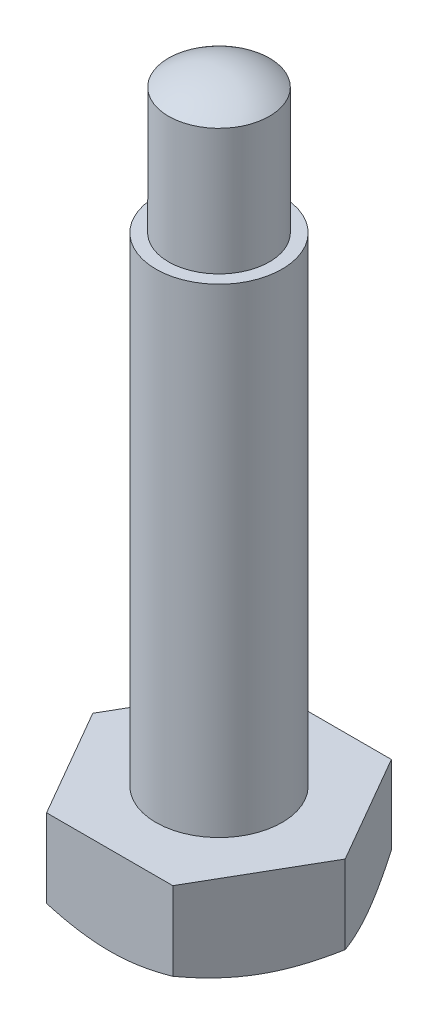
ISO-10303-21;
HEADER;
FILE_DESCRIPTION(('STEP AP214'),'2;1');
FILE_NAME('part.step','',(''),(''),'','','');
FILE_SCHEMA(('AUTOMOTIVE_DESIGN { 1 0 10303 214 1 1 1 1 }'));
ENDSEC;
DATA;
#1=APPLICATION_CONTEXT('core data for automotive mechanical design processes');
#2=APPLICATION_PROTOCOL_DEFINITION('international standard','automotive_design',2000,#1);
#3=PRODUCT_CONTEXT('',#1,'mechanical');
#4=PRODUCT('Part','Part','',(#3));
#5=PRODUCT_RELATED_PRODUCT_CATEGORY('part','',(#4));
#6=PRODUCT_DEFINITION_FORMATION('','',#4);
#7=PRODUCT_DEFINITION_CONTEXT('part definition',#1,'design');
#8=PRODUCT_DEFINITION('design','',#6,#7);
#9=PRODUCT_DEFINITION_SHAPE('','',#8);
#10=(LENGTH_UNIT() NAMED_UNIT(*) SI_UNIT(.MILLI.,.METRE.));
#11=(NAMED_UNIT(*) PLANE_ANGLE_UNIT() SI_UNIT($,.RADIAN.));
#12=(NAMED_UNIT(*) SI_UNIT($,.STERADIAN.) SOLID_ANGLE_UNIT());
#13=UNCERTAINTY_MEASURE_WITH_UNIT(LENGTH_MEASURE(1.E-05),#10,'distance_accuracy_value','');
#14=(GEOMETRIC_REPRESENTATION_CONTEXT(3) GLOBAL_UNCERTAINTY_ASSIGNED_CONTEXT((#13)) GLOBAL_UNIT_ASSIGNED_CONTEXT((#10,
#11,#12)) REPRESENTATION_CONTEXT('',''));
#15=CARTESIAN_POINT('',(0.,0.,0.));
#16=DIRECTION('',(0.,0.,1.));
#17=DIRECTION('',(1.,0.,0.));
#18=AXIS2_PLACEMENT_3D('',#15,#16,#17);
#19=CARTESIAN_POINT('',(0.,10.5,13.));
#20=DIRECTION('',(0.,0.,-1.));
#21=DIRECTION('',(-1.,0.,0.));
#22=AXIS2_PLACEMENT_3D('',#19,#20,#21);
#23=PLANE('',#22);
#24=CARTESIAN_POINT('',(25.8246872384504,9.18690458758503,13.));
#25=CARTESIAN_POINT('',(25.2239001535883,8.87712209207722,13.));
#26=CARTESIAN_POINT('',(24.6222488430981,8.56900123593337,13.));
#27=CARTESIAN_POINT('',(23.4168216388284,7.95691917054028,13.));
#28=CARTESIAN_POINT('',(22.8130457070556,7.65295803615649,13.));
#29=CARTESIAN_POINT('',(21.6020218906626,7.04955827225552,13.));
#30=CARTESIAN_POINT('',(20.9947699844909,6.75012770019506,13.));
#31=CARTESIAN_POINT('',(19.7772453935875,6.15744028127332,13.));
#32=CARTESIAN_POINT('',(19.1669726663946,5.86418352149856,13.));
#33=CARTESIAN_POINT('',(17.9103142053365,5.26997573140754,13.));
#34=CARTESIAN_POINT('',(17.2637305625632,4.96944215548688,13.));
#35=CARTESIAN_POINT('',(15.9656600222432,4.37920179291307,13.));
#36=CARTESIAN_POINT('',(15.3141733685951,4.08949447193258,13.));
#37=CARTESIAN_POINT('',(14.005581640315,3.52422290276731,13.));
#38=CARTESIAN_POINT('',(13.3484805692396,3.24864942169311,13.));
#39=CARTESIAN_POINT('',(12.0267172363692,2.71563124762287,13.));
#40=CARTESIAN_POINT('',(11.3620532768854,2.45819072216776,13.));
#41=CARTESIAN_POINT('',(10.3061406938233,2.07093924425136,13.));
#42=CARTESIAN_POINT('',(9.9178360757333,1.93310195061186,13.));
#43=CARTESIAN_POINT('',(9.13795439534631,1.66692705797791,13.));
#44=CARTESIAN_POINT('',(8.74637722640137,1.53858976992976,13.));
#45=CARTESIAN_POINT('',(7.95988922261086,1.29312941361622,13.));
#46=CARTESIAN_POINT('',(7.56497986987499,1.17600161892836,13.));
#47=CARTESIAN_POINT('',(6.77152674049265,0.954803194867602,13.));
#48=CARTESIAN_POINT('',(6.37298320955255,0.850731689679436,13.));
#49=CARTESIAN_POINT('',(5.57990087780534,0.659575573717108,13.));
#50=CARTESIAN_POINT('',(5.18543183420926,0.57220349144165,13.));
#51=CARTESIAN_POINT('',(4.39315827144887,0.414078759218041,13.));
#52=CARTESIAN_POINT('',(3.99535383011514,0.343325722580617,13.));
#53=CARTESIAN_POINT('',(3.19704622204219,0.220446822088198,13.));
#54=CARTESIAN_POINT('',(2.79654444181181,0.168312036705864,13.));
#55=CARTESIAN_POINT('',(1.99340286961405,0.0843026080209752,13.));
#56=CARTESIAN_POINT('',(1.590763095676,0.0524277941424217,13.));
#57=CARTESIAN_POINT('',(0.778676784558731,0.00977732830657111,13.));
#58=CARTESIAN_POINT('',(0.369214122951668,-0.000695449274601091,13.));
#59=CARTESIAN_POINT('',(-0.449669771278856,0.000767319344551138,13.));
#60=CARTESIAN_POINT('',(-0.859091003934603,0.0127028479452738,13.));
#61=CARTESIAN_POINT('',(-1.67679745137997,0.0585278382419036,13.));
#62=CARTESIAN_POINT('',(-2.08508233689663,0.0924231084010017,13.));
#63=CARTESIAN_POINT('',(-2.89938444098698,0.180938142670322,13.));
#64=CARTESIAN_POINT('',(-3.30540160183822,0.235558431895841,13.));
#65=CARTESIAN_POINT('',(-4.12261810471319,0.365033300745678,13.));
#66=CARTESIAN_POINT('',(-4.53375538813513,0.440276034346108,13.));
#67=CARTESIAN_POINT('',(-5.35244644843194,0.608266057316976,13.));
#68=CARTESIAN_POINT('',(-5.75999987907133,0.701015018932496,13.));
#69=CARTESIAN_POINT('',(-6.57138761794816,0.901758900327339,13.));
#70=CARTESIAN_POINT('',(-6.97522121669671,1.00975666691951,13.));
#71=CARTESIAN_POINT('',(-7.77914130693661,1.23883132448338,13.));
#72=CARTESIAN_POINT('',(-8.17922777920995,1.35990828249487,13.));
#73=CARTESIAN_POINT('',(-8.96400695478482,1.60944077117424,13.));
#74=CARTESIAN_POINT('',(-9.34880387659923,1.73757024584093,13.));
#75=CARTESIAN_POINT('',(-10.1153078928348,2.00278178266101,13.));
#76=CARTESIAN_POINT('',(-10.4970148490308,2.1398642428529,13.));
#77=CARTESIAN_POINT('',(-11.2576660557892,2.42168094752855,13.));
#78=CARTESIAN_POINT('',(-11.6366097745286,2.56641662293878,13.));
#79=CARTESIAN_POINT('',(-12.3919508105838,2.86240237108954,13.));
#80=CARTESIAN_POINT('',(-12.7683480524455,3.01365263589233,13.));
#81=CARTESIAN_POINT('',(-13.5192679813148,3.32189315993379,13.));
#82=CARTESIAN_POINT('',(-13.8937881276384,3.4788895965697,13.));
#83=CARTESIAN_POINT('',(-14.6407830480577,3.79768125710073,13.));
#84=CARTESIAN_POINT('',(-15.013257789007,3.95947655849259,13.));
#85=CARTESIAN_POINT('',(-16.1278602284714,4.45099511613222,13.));
#86=CARTESIAN_POINT('',(-16.8672667761093,4.78689276490677,13.));
#87=CARTESIAN_POINT('',(-18.2979200310502,5.45135444671315,13.));
#88=CARTESIAN_POINT('',(-18.9894894247793,5.77922803882722,13.));
#89=CARTESIAN_POINT('',(-20.3685212678706,6.4435470803542,13.));
#90=CARTESIAN_POINT('',(-21.0559835767812,6.77999282086421,13.));
#91=CARTESIAN_POINT('',(-22.4252284660856,7.45849162297922,13.));
#92=CARTESIAN_POINT('',(-23.107022399224,7.80052181819178,13.));
#93=CARTESIAN_POINT('',(-24.1276320522499,8.31759524203726,13.));
#94=CARTESIAN_POINT('',(-24.4674742624435,8.49061710358882,13.));
#95=CARTESIAN_POINT('',(-25.1465337963473,8.8378790472685,13.));
#96=CARTESIAN_POINT('',(-25.4857511229682,9.01211912370402,13.));
#97=CARTESIAN_POINT('',(-25.8246872384504,9.18690458758503,13.));
#98=B_SPLINE_CURVE_WITH_KNOTS('',3,(#24,#25,#26,#27,#28,#29,#30,#31,#32,#33,#34,#35,#36,#37,#38,
#39,#40,#41,#42,#43,#44,#45,#46,#47,#48,#49,#50,#51,#52,#53,#54,#55,#56,#57,#58,#59,#60,#61,#62,
#63,#64,#65,#66,#67,#68,#69,#70,#71,#72,#73,#74,#75,#76,#77,#78,#79,#80,#81,#82,#83,#84,#85,#86,
#87,#88,#89,#90,#91,#92,#93,#94,#95,#96,#97),.UNSPECIFIED.,.F.,.F.,(4,2,2,2,2,2,2,2,2,2,2,2,2,2,
2,2,2,2,2,2,2,2,2,2,2,2,2,2,2,2,2,2,2,2,2,2,4),(0.,2.027861514399,4.05575947778182,
6.08691805313908,8.11810526042382,10.2570748892785,12.3959388099735,14.5333872476806,
16.6713253480815,17.9073565551179,19.1434282010314,20.3789763463417,21.6144415667766,
22.8262155174258,24.0379612699206,25.2491255943046,26.4602797213248,27.6884582169194,
28.9166357478965,30.1451382707723,31.3736719226207,32.6271384222511,33.8807247172462,
35.134545355577,36.388372420899,37.6049512178982,38.821584139331,40.0384453453103,
41.2553424512188,42.4735885923913,43.6918544177176,46.128059313981,48.4240608788741,
50.7201405166735,53.008439033447,54.1524928479491,55.2965413199742),.UNSPECIFIED.);
#99=CARTESIAN_POINT('',(7.50555349946513,1.16111316720153,13.));
#100=VERTEX_POINT('',#99);
#101=CARTESIAN_POINT('',(0.,0.,13.));
#102=VERTEX_POINT('',#101);
#103=EDGE_CURVE('E317',#100,#102,#98,.T.);
#104=ORIENTED_EDGE('',*,*,#103,.F.);
#105=DIRECTION('',(0.,-1.,0.));
#106=VECTOR('',#105,1.);
#107=CARTESIAN_POINT('',(7.50555349946513,10.5,13.));
#108=LINE('',#107,#106);
#109=CARTESIAN_POINT('',(7.50555349946513,10.5,13.));
#110=VERTEX_POINT('',#109);
#111=EDGE_CURVE('E258',#110,#100,#108,.T.);
#112=ORIENTED_EDGE('',*,*,#111,.F.);
#113=DIRECTION('',(1.,0.,0.));
#114=VECTOR('',#113,1.);
#115=CARTESIAN_POINT('',(0.,10.5,13.));
#116=LINE('',#115,#114);
#117=CARTESIAN_POINT('',(-7.50555349946514,10.5,13.));
#118=VERTEX_POINT('',#117);
#119=EDGE_CURVE('E288',#118,#110,#116,.T.);
#120=ORIENTED_EDGE('',*,*,#119,.F.);
#121=DIRECTION('',(0.,-1.,0.));
#122=VECTOR('',#121,1.);
#123=CARTESIAN_POINT('',(-7.50555349946514,10.5,13.));
#124=LINE('',#123,#122);
#125=CARTESIAN_POINT('',(-7.50555349946514,1.16111316720153,13.));
#126=VERTEX_POINT('',#125);
#127=EDGE_CURVE('E270',#118,#126,#124,.T.);
#128=ORIENTED_EDGE('',*,*,#127,.T.);
#129=EDGE_CURVE('E196',#102,#126,#98,.T.);
#130=ORIENTED_EDGE('',*,*,#129,.F.);
#131=EDGE_LOOP('',(#104,#112,#120,#128,#130));
#132=FACE_BOUND('',#131,.T.);
#133=ADVANCED_FACE('F67',(#132),#23,.F.);
#134=CARTESIAN_POINT('',(11.2583302491977,10.5,6.5));
#135=DIRECTION('',(-0.866025403784439,0.,-0.5));
#136=DIRECTION('',(-0.5,0.,0.866025403784439));
#137=AXIS2_PLACEMENT_3D('',#134,#135,#136);
#138=PLANE('',#137);
#139=CARTESIAN_POINT('',(15.0112224689841,1.16117983463742,-0.000200000000004337));
#140=CARTESIAN_POINT('',(14.8462532234622,1.06594073922636,0.28553511493024));
#141=CARTESIAN_POINT('',(14.6806405091528,0.975023388768643,0.572384750493533));
#142=CARTESIAN_POINT('',(14.3480870597607,0.803033479193874,1.14838422107288));
#143=CARTESIAN_POINT('',(14.1811459070207,0.721964158005886,1.43753477949267));
#144=CARTESIAN_POINT('',(13.8456129426453,0.570760039914846,2.01869492140517));
#145=CARTESIAN_POINT('',(13.677018194831,0.500651114596917,2.31070959050873));
#146=CARTESIAN_POINT('',(13.3386571650651,0.372873231406378,2.89676808536455));
#147=CARTESIAN_POINT('',(13.1688909505188,0.315203563847,3.19081179436736));
#148=CARTESIAN_POINT('',(12.8325370588066,0.214757089290658,3.77339382413656));
#149=CARTESIAN_POINT('',(12.6659743531007,0.171647823691187,4.0618888930652));
#150=CARTESIAN_POINT('',(12.3320857121334,0.0993629979137938,4.6402009832907));
#151=CARTESIAN_POINT('',(12.164759762244,0.0701877059299412,4.93001802992393));
#152=CARTESIAN_POINT('',(11.829826771922,0.0265074870306271,5.51013898629262));
#153=CARTESIAN_POINT('',(11.6622203037118,0.0119851270560766,5.80044190490974));
#154=CARTESIAN_POINT('',(11.3268526424848,-0.00207691304846538,6.38131573337049));
#155=CARTESIAN_POINT('',(11.1590914544088,-0.00161705611710478,6.67188663465624));
#156=CARTESIAN_POINT('',(10.8454621582709,0.0132389071962976,7.21510851030914));
#157=CARTESIAN_POINT('',(10.6995717015937,0.0258229433100638,7.46779819361344));
#158=CARTESIAN_POINT('',(10.4081263689782,0.0620843798054116,7.97259631733243));
#159=CARTESIAN_POINT('',(10.2625715175088,0.085762564867195,8.22470471536558));
#160=CARTESIAN_POINT('',(9.97187645625749,0.143799449915545,8.72820333096215));
#161=CARTESIAN_POINT('',(9.82673668922661,0.178166971252932,8.97959278165833));
#162=CARTESIAN_POINT('',(9.5371376012129,0.256979550610595,9.48119311592368));
#163=CARTESIAN_POINT('',(9.39267832717071,0.301425293732573,9.73140391818929));
#164=CARTESIAN_POINT('',(8.9541641315381,0.451003390781539,10.4909327848652));
#165=CARTESIAN_POINT('',(8.66137908356622,0.571050318482427,10.9980513636489));
#166=CARTESIAN_POINT('',(8.08017480212894,0.843507833939792,12.0047267086749));
#167=CARTESIAN_POINT('',(7.79174812714238,0.995854432961327,12.5042963640098));
#168=CARTESIAN_POINT('',(7.50543802941129,1.16117983463742,13.0002));
#169=B_SPLINE_CURVE_WITH_KNOTS('',3,(#139,#140,#141,#142,#143,#144,#145,#146,#147,#148,#149,
#150,#151,#152,#153,#154,#155,#156,#157,#158,#159,#160,#161,#162,#163,#164,#165,#166,#167,#168),
.UNSPECIFIED.,.F.,.F.,(4,2,2,2,2,2,2,2,2,2,2,2,2,2,4),(0.,1.03025461984708,2.0608470650412,
3.09383660213902,4.12676718933493,5.13420251692741,6.14165723434359,7.14791193250861,
8.15413553822912,9.03008081731204,9.90608806065233,10.7828201537635,11.6596118636232,
13.4517531627236,15.240376691212),.UNSPECIFIED.);
#170=CARTESIAN_POINT('',(15.0111069989303,1.16111316720152,0.));
#171=VERTEX_POINT('',#170);
#172=CARTESIAN_POINT('',(11.2583302491977,0.,6.5));
#173=VERTEX_POINT('',#172);
#174=EDGE_CURVE('E181',#171,#173,#169,.T.);
#175=ORIENTED_EDGE('',*,*,#174,.F.);
#176=DIRECTION('',(0.,-1.,0.));
#177=VECTOR('',#176,1.);
#178=CARTESIAN_POINT('',(15.0111069989303,10.5,0.));
#179=LINE('',#178,#177);
#180=CARTESIAN_POINT('',(15.0111069989303,10.5,0.));
#181=VERTEX_POINT('',#180);
#182=EDGE_CURVE('E251',#181,#171,#179,.T.);
#183=ORIENTED_EDGE('',*,*,#182,.F.);
#184=DIRECTION('',(0.5,0.,-0.866025403784439));
#185=VECTOR('',#184,1.);
#186=CARTESIAN_POINT('',(11.2583302491977,10.5,6.5));
#187=LINE('',#186,#185);
#188=EDGE_CURVE('E285',#110,#181,#187,.T.);
#189=ORIENTED_EDGE('',*,*,#188,.F.);
#190=ORIENTED_EDGE('',*,*,#111,.T.);
#191=EDGE_CURVE('E172',#173,#100,#169,.T.);
#192=ORIENTED_EDGE('',*,*,#191,.F.);
#193=EDGE_LOOP('',(#175,#183,#189,#190,#192));
#194=FACE_BOUND('',#193,.T.);
#195=ADVANCED_FACE('F237',(#194),#138,.F.);
#196=CARTESIAN_POINT('',(11.2583302491977,10.5,-6.5));
#197=DIRECTION('',(-0.866025403784439,0.,0.5));
#198=DIRECTION('',(0.5,0.,0.866025403784439));
#199=AXIS2_PLACEMENT_3D('',#196,#197,#198);
#200=PLANE('',#199);
#201=CARTESIAN_POINT('',(7.50543802941129,1.16117983463742,-13.0002));
#202=CARTESIAN_POINT('',(7.67040727493319,1.06594073922636,-12.7144648850698));
#203=CARTESIAN_POINT('',(7.83601998924261,0.975023388768646,-12.4276152495065));
#204=CARTESIAN_POINT('',(8.16857343863467,0.803033479193878,-11.8516157789271));
#205=CARTESIAN_POINT('',(8.33551459137467,0.72196415800589,-11.5624652205073));
#206=CARTESIAN_POINT('',(8.67104755575013,0.57076003991485,-10.9813050785948));
#207=CARTESIAN_POINT('',(8.83964230356439,0.50065111459692,-10.6892904094913));
#208=CARTESIAN_POINT('',(9.17800333333027,0.372873231406381,-10.1032319146355));
#209=CARTESIAN_POINT('',(9.34776954787656,0.315203563847003,-9.80918820563265));
#210=CARTESIAN_POINT('',(9.68412343958884,0.214757089290661,-9.22660617586345));
#211=CARTESIAN_POINT('',(9.85068614529467,0.171647823691188,-8.93811110693481));
#212=CARTESIAN_POINT('',(10.184574786262,0.0993629979137945,-8.35979901670931));
#213=CARTESIAN_POINT('',(10.3519007361514,0.0701877059299417,-8.06998197007607));
#214=CARTESIAN_POINT('',(10.6868337264734,0.0265074870306278,-7.48986101370739));
#215=CARTESIAN_POINT('',(10.8544401946836,0.0119851270560775,-7.19955809509027));
#216=CARTESIAN_POINT('',(11.1898078559106,-0.002076913048465,-6.61868426662952));
#217=CARTESIAN_POINT('',(11.3575690439866,-0.00161705611710526,-6.32811336534377));
#218=CARTESIAN_POINT('',(11.6711983401245,0.0132389071962964,-5.78489148969088));
#219=CARTESIAN_POINT('',(11.8170887968016,0.0258229433100626,-5.53220180638657));
#220=CARTESIAN_POINT('',(12.1085341294172,0.0620843798054103,-5.02740368266758));
#221=CARTESIAN_POINT('',(12.2540889808866,0.0857625648671937,-4.77529528463443));
#222=CARTESIAN_POINT('',(12.5447840421379,0.143799449915544,-4.27179666903786));
#223=CARTESIAN_POINT('',(12.6899238091688,0.17816697125293,-4.02040721834167));
#224=CARTESIAN_POINT('',(12.9795228971825,0.256979550610594,-3.51880688407632));
#225=CARTESIAN_POINT('',(13.1239821712247,0.301425293732572,-3.26859608181072));
#226=CARTESIAN_POINT('',(13.5624963668573,0.451003390781537,-2.50906721513485));
#227=CARTESIAN_POINT('',(13.8552814148292,0.571050318482424,-2.00194863635106));
#228=CARTESIAN_POINT('',(14.4364856962665,0.843507833939787,-0.995273291325125));
#229=CARTESIAN_POINT('',(14.724912371253,0.995854432961322,-0.495703635990247));
#230=CARTESIAN_POINT('',(15.0112224689841,1.16117983463742,0.000199999999995744));
#231=B_SPLINE_CURVE_WITH_KNOTS('',3,(#201,#202,#203,#204,#205,#206,#207,#208,#209,#210,#211,
#212,#213,#214,#215,#216,#217,#218,#219,#220,#221,#222,#223,#224,#225,#226,#227,#228,#229,#230),
.UNSPECIFIED.,.F.,.F.,(4,2,2,2,2,2,2,2,2,2,2,2,2,2,4),(0.,1.03025461984708,2.0608470650412,
3.09383660213902,4.12676718933493,5.13420251692742,6.14165723434359,7.14791193250861,
8.15413553822912,9.03008081731204,9.90608806065233,10.7828201537635,11.6596118636232,
13.4517531627236,15.240376691212),.UNSPECIFIED.);
#232=CARTESIAN_POINT('',(7.50555349946517,1.1611131672015,-13.));
#233=VERTEX_POINT('',#232);
#234=CARTESIAN_POINT('',(11.2583302491977,0.,-6.5));
#235=VERTEX_POINT('',#234);
#236=EDGE_CURVE('E151',#233,#235,#231,.T.);
#237=ORIENTED_EDGE('',*,*,#236,.F.);
#238=DIRECTION('',(0.,-1.,0.));
#239=VECTOR('',#238,1.);
#240=CARTESIAN_POINT('',(7.50555349946513,10.5,-13.));
#241=LINE('',#240,#239);
#242=CARTESIAN_POINT('',(7.50555349946513,10.5,-13.));
#243=VERTEX_POINT('',#242);
#244=EDGE_CURVE('E178',#243,#233,#241,.T.);
#245=ORIENTED_EDGE('',*,*,#244,.F.);
#246=DIRECTION('',(-0.5,0.,-0.866025403784439));
#247=VECTOR('',#246,1.);
#248=CARTESIAN_POINT('',(11.2583302491977,10.5,-6.5));
#249=LINE('',#248,#247);
#250=EDGE_CURVE('E256',#181,#243,#249,.T.);
#251=ORIENTED_EDGE('',*,*,#250,.F.);
#252=ORIENTED_EDGE('',*,*,#182,.T.);
#253=EDGE_CURVE('E180',#235,#171,#231,.T.);
#254=ORIENTED_EDGE('',*,*,#253,.F.);
#255=EDGE_LOOP('',(#237,#245,#251,#252,#254));
#256=FACE_BOUND('',#255,.T.);
#257=ADVANCED_FACE('F234',(#256),#200,.F.);
#258=CARTESIAN_POINT('',(0.,10.5,-13.));
#259=DIRECTION('',(0.,0.,1.));
#260=DIRECTION('',(1.,0.,0.));
#261=AXIS2_PLACEMENT_3D('',#258,#259,#260);
#262=PLANE('',#261);
#263=CARTESIAN_POINT('',(-25.8246872384504,9.18690458758503,-13.));
#264=CARTESIAN_POINT('',(-25.2239001535883,8.87712209207722,-13.));
#265=CARTESIAN_POINT('',(-24.6222488430981,8.56900123593337,-13.));
#266=CARTESIAN_POINT('',(-23.4168216388284,7.95691917054028,-13.));
#267=CARTESIAN_POINT('',(-22.8130457070556,7.65295803615649,-13.));
#268=CARTESIAN_POINT('',(-21.6020218906626,7.04955827225552,-13.));
#269=CARTESIAN_POINT('',(-20.9947699844909,6.75012770019506,-13.));
#270=CARTESIAN_POINT('',(-19.7772453935875,6.15744028127332,-13.));
#271=CARTESIAN_POINT('',(-19.1669726663946,5.86418352149856,-13.));
#272=CARTESIAN_POINT('',(-17.9103142053365,5.26997573140754,-13.));
#273=CARTESIAN_POINT('',(-17.2637305625632,4.96944215548688,-13.));
#274=CARTESIAN_POINT('',(-15.9656600222432,4.37920179291307,-13.));
#275=CARTESIAN_POINT('',(-15.3141733685951,4.08949447193258,-13.));
#276=CARTESIAN_POINT('',(-14.005581640315,3.52422290276731,-13.));
#277=CARTESIAN_POINT('',(-13.3484805692396,3.24864942169311,-13.));
#278=CARTESIAN_POINT('',(-12.0267172363692,2.71563124762288,-13.));
#279=CARTESIAN_POINT('',(-11.3620532768854,2.45819072216776,-13.));
#280=CARTESIAN_POINT('',(-10.3061406938233,2.07093924425136,-13.));
#281=CARTESIAN_POINT('',(-9.91783607573329,1.93310195061186,-13.));
#282=CARTESIAN_POINT('',(-9.13795439534631,1.66692705797791,-13.));
#283=CARTESIAN_POINT('',(-8.74637722640137,1.53858976992976,-13.));
#284=CARTESIAN_POINT('',(-7.95988922261086,1.29312941361623,-13.));
#285=CARTESIAN_POINT('',(-7.56497986987498,1.17600161892837,-13.));
#286=CARTESIAN_POINT('',(-6.77152674049265,0.954803194867604,-13.));
#287=CARTESIAN_POINT('',(-6.37298320955255,0.850731689679439,-13.));
#288=CARTESIAN_POINT('',(-5.57990087780533,0.659575573717111,-13.));
#289=CARTESIAN_POINT('',(-5.18543183420926,0.572203491441652,-13.));
#290=CARTESIAN_POINT('',(-4.39315827144886,0.414078759218044,-13.));
#291=CARTESIAN_POINT('',(-3.99535383011514,0.34332572258062,-13.));
#292=CARTESIAN_POINT('',(-3.19704622204218,0.220446822088201,-13.));
#293=CARTESIAN_POINT('',(-2.79654444181181,0.168312036705867,-13.));
#294=CARTESIAN_POINT('',(-1.99340286961405,0.0843026080209776,-13.));
#295=CARTESIAN_POINT('',(-1.59076309567599,0.0524277941424242,-13.));
#296=CARTESIAN_POINT('',(-0.778676784558727,0.00977732830657442,-13.));
#297=CARTESIAN_POINT('',(-0.369214122951665,-0.000695449274597251,-13.));
#298=CARTESIAN_POINT('',(0.449669771278858,0.000767319344555324,-13.));
#299=CARTESIAN_POINT('',(0.859091003934605,0.0127028479452778,-13.));
#300=CARTESIAN_POINT('',(1.67679745137997,0.0585278382419079,-13.));
#301=CARTESIAN_POINT('',(2.08508233689663,0.0924231084010062,-13.));
#302=CARTESIAN_POINT('',(2.89938444098698,0.180938142670326,-13.));
#303=CARTESIAN_POINT('',(3.30540160183822,0.235558431895845,-13.));
#304=CARTESIAN_POINT('',(4.1226181047132,0.365033300745683,-13.));
#305=CARTESIAN_POINT('',(4.53375538813514,0.440276034346113,-13.));
#306=CARTESIAN_POINT('',(5.35244644843195,0.608266057316982,-13.));
#307=CARTESIAN_POINT('',(5.75999987907134,0.701015018932502,-13.));
#308=CARTESIAN_POINT('',(6.57138761794817,0.901758900327345,-13.));
#309=CARTESIAN_POINT('',(6.97522121669672,1.00975666691951,-13.));
#310=CARTESIAN_POINT('',(7.77914130693662,1.23883132448339,-13.));
#311=CARTESIAN_POINT('',(8.17922777920996,1.35990828249488,-13.));
#312=CARTESIAN_POINT('',(8.96400695478483,1.60944077117425,-13.));
#313=CARTESIAN_POINT('',(9.34880387659924,1.73757024584094,-13.));
#314=CARTESIAN_POINT('',(10.1153078928348,2.00278178266101,-13.));
#315=CARTESIAN_POINT('',(10.4970148490308,2.13986424285291,-13.));
#316=CARTESIAN_POINT('',(11.2576660557892,2.42168094752856,-13.));
#317=CARTESIAN_POINT('',(11.6366097745286,2.56641662293878,-13.));
#318=CARTESIAN_POINT('',(12.3919508105838,2.86240237108954,-13.));
#319=CARTESIAN_POINT('',(12.7683480524455,3.01365263589234,-13.));
#320=CARTESIAN_POINT('',(13.5192679813148,3.32189315993379,-13.));
#321=CARTESIAN_POINT('',(13.8937881276384,3.47888959656971,-13.));
#322=CARTESIAN_POINT('',(14.6407830480577,3.79768125710073,-13.));
#323=CARTESIAN_POINT('',(15.013257789007,3.9594765584926,-13.));
#324=CARTESIAN_POINT('',(16.1278602284714,4.45099511613222,-13.));
#325=CARTESIAN_POINT('',(16.8672667761093,4.78689276490677,-13.));
#326=CARTESIAN_POINT('',(18.2979200310502,5.45135444671315,-13.));
#327=CARTESIAN_POINT('',(18.9894894247793,5.77922803882722,-13.));
#328=CARTESIAN_POINT('',(20.3685212678706,6.44354708035419,-13.));
#329=CARTESIAN_POINT('',(21.0559835767812,6.7799928208642,-13.));
#330=CARTESIAN_POINT('',(22.4252284660856,7.45849162297921,-13.));
#331=CARTESIAN_POINT('',(23.107022399224,7.80052181819178,-13.));
#332=CARTESIAN_POINT('',(24.1276320522499,8.31759524203725,-13.));
#333=CARTESIAN_POINT('',(24.4674742624435,8.49061710358881,-13.));
#334=CARTESIAN_POINT('',(25.1465337963472,8.83787904726849,-13.));
#335=CARTESIAN_POINT('',(25.4857511229681,9.01211912370401,-13.));
#336=CARTESIAN_POINT('',(25.8246872384504,9.18690458758502,-13.));
#337=B_SPLINE_CURVE_WITH_KNOTS('',3,(#263,#264,#265,#266,#267,#268,#269,#270,#271,#272,#273,
#274,#275,#276,#277,#278,#279,#280,#281,#282,#283,#284,#285,#286,#287,#288,#289,#290,#291,#292,
#293,#294,#295,#296,#297,#298,#299,#300,#301,#302,#303,#304,#305,#306,#307,#308,#309,#310,#311,
#312,#313,#314,#315,#316,#317,#318,#319,#320,#321,#322,#323,#324,#325,#326,#327,#328,#329,#330,
#331,#332,#333,#334,#335,#336),.UNSPECIFIED.,.F.,.F.,(4,2,2,2,2,2,2,2,2,2,2,2,2,2,2,2,2,2,2,2,2,
2,2,2,2,2,2,2,2,2,2,2,2,2,2,2,4),(0.,2.027861514399,4.05575947778182,6.08691805313907,
8.11810526042382,10.2570748892785,12.3959388099735,14.5333872476806,16.6713253480815,
17.9073565551179,19.1434282010314,20.3789763463418,21.6144415667766,22.8262155174259,
24.0379612699206,25.2491255943046,26.4602797213248,27.6884582169194,28.9166357478965,
30.1451382707723,31.3736719226207,32.6271384222511,33.8807247172462,35.134545355577,
36.388372420899,37.6049512178982,38.821584139331,40.0384453453103,41.2553424512187,
42.4735885923913,43.6918544177176,46.128059313981,48.4240608788741,50.7201405166734,
53.0084390334469,54.1524928479491,55.2965413199742),.UNSPECIFIED.);
#338=CARTESIAN_POINT('',(-7.50555349946514,1.16111316720153,-13.));
#339=VERTEX_POINT('',#338);
#340=CARTESIAN_POINT('',(0.,0.,-13.));
#341=VERTEX_POINT('',#340);
#342=EDGE_CURVE('E163',#339,#341,#337,.T.);
#343=ORIENTED_EDGE('',*,*,#342,.F.);
#344=DIRECTION('',(0.,-1.,0.));
#345=VECTOR('',#344,1.);
#346=CARTESIAN_POINT('',(-7.50555349946514,10.5,-13.));
#347=LINE('',#346,#345);
#348=CARTESIAN_POINT('',(-7.50555349946514,10.5,-13.));
#349=VERTEX_POINT('',#348);
#350=EDGE_CURVE('E262',#349,#339,#347,.T.);
#351=ORIENTED_EDGE('',*,*,#350,.F.);
#352=DIRECTION('',(-1.,0.,0.));
#353=VECTOR('',#352,1.);
#354=CARTESIAN_POINT('',(0.,10.5,-13.));
#355=LINE('',#354,#353);
#356=EDGE_CURVE('E280',#243,#349,#355,.T.);
#357=ORIENTED_EDGE('',*,*,#356,.F.);
#358=ORIENTED_EDGE('',*,*,#244,.T.);
#359=EDGE_CURVE('E149',#341,#233,#337,.T.);
#360=ORIENTED_EDGE('',*,*,#359,.F.);
#361=EDGE_LOOP('',(#343,#351,#357,#358,#360));
#362=FACE_BOUND('',#361,.T.);
#363=ADVANCED_FACE('F175',(#362),#262,.F.);
#364=CARTESIAN_POINT('',(-11.2583302491977,10.5,-6.5));
#365=DIRECTION('',(0.866025403784439,0.,0.5));
#366=DIRECTION('',(0.5,0.,-0.866025403784439));
#367=AXIS2_PLACEMENT_3D('',#364,#365,#366);
#368=PLANE('',#367);
#369=CARTESIAN_POINT('',(-15.0112224689841,1.16117983463742,0.00019999999999674));
#370=CARTESIAN_POINT('',(-14.8462532234622,1.06594073922636,-0.285535114930248));
#371=CARTESIAN_POINT('',(-14.6806405091528,0.975023388768647,-0.572384750493542));
#372=CARTESIAN_POINT('',(-14.3480870597607,0.803033479193878,-1.14838422107289));
#373=CARTESIAN_POINT('',(-14.1811459070207,0.72196415800589,-1.43753477949268));
#374=CARTESIAN_POINT('',(-13.8456129426453,0.57076003991485,-2.01869492140517));
#375=CARTESIAN_POINT('',(-13.677018194831,0.500651114596921,-2.31070959050874));
#376=CARTESIAN_POINT('',(-13.3386571650651,0.372873231406383,-2.89676808536456));
#377=CARTESIAN_POINT('',(-13.1688909505188,0.315203563847005,-3.19081179436737));
#378=CARTESIAN_POINT('',(-12.8325370588066,0.214757089290663,-3.77339382413657));
#379=CARTESIAN_POINT('',(-12.6659743531007,0.171647823691191,-4.06188889306521));
#380=CARTESIAN_POINT('',(-12.3320857121334,0.0993629979137986,-4.64020098329071));
#381=CARTESIAN_POINT('',(-12.164759762244,0.0701877059299458,-4.93001802992395));
#382=CARTESIAN_POINT('',(-11.829826771922,0.0265074870306319,-5.51013898629263));
#383=CARTESIAN_POINT('',(-11.6622203037118,0.0119851270560816,-5.80044190490975));
#384=CARTESIAN_POINT('',(-11.3268526424848,-0.00207691304845979,-6.3813157333705));
#385=CARTESIAN_POINT('',(-11.1590914544088,-0.00161705611709888,-6.67188663465625));
#386=CARTESIAN_POINT('',(-10.8454621582709,0.0132389071963029,-7.21510851030915));
#387=CARTESIAN_POINT('',(-10.6995717015938,0.0258229433100684,-7.46779819361345));
#388=CARTESIAN_POINT('',(-10.4081263689782,0.0620843798054164,-7.97259631733244));
#389=CARTESIAN_POINT('',(-10.2625715175088,0.0857625648672007,-8.22470471536559));
#390=CARTESIAN_POINT('',(-9.97187645625749,0.143799449915552,-8.72820333096215));
#391=CARTESIAN_POINT('',(-9.82673668922662,0.178166971252938,-8.97959278165834));
#392=CARTESIAN_POINT('',(-9.53713760121291,0.256979550610601,-9.48119311592369));
#393=CARTESIAN_POINT('',(-9.39267832717071,0.301425293732579,-9.7314039181893));
#394=CARTESIAN_POINT('',(-8.95416413153811,0.451003390781546,-10.4909327848652));
#395=CARTESIAN_POINT('',(-8.66137908356623,0.571050318482433,-10.998051363649));
#396=CARTESIAN_POINT('',(-8.08017480212894,0.843507833939796,-12.0047267086749));
#397=CARTESIAN_POINT('',(-7.79174812714238,0.995854432961331,-12.5042963640098));
#398=CARTESIAN_POINT('',(-7.5054380294113,1.16117983463742,-13.0002));
#399=B_SPLINE_CURVE_WITH_KNOTS('',3,(#369,#370,#371,#372,#373,#374,#375,#376,#377,#378,#379,
#380,#381,#382,#383,#384,#385,#386,#387,#388,#389,#390,#391,#392,#393,#394,#395,#396,#397,#398),
.UNSPECIFIED.,.F.,.F.,(4,2,2,2,2,2,2,2,2,2,2,2,2,2,4),(0.,1.03025461984709,2.0608470650412,
3.09383660213902,4.12676718933493,5.13420251692742,6.14165723434359,7.14791193250861,
8.15413553822912,9.03008081731204,9.90608806065233,10.7828201537635,11.6596118636232,
13.4517531627236,15.240376691212),.UNSPECIFIED.);
#400=CARTESIAN_POINT('',(-15.0111069989303,1.16111316720153,0.));
#401=VERTEX_POINT('',#400);
#402=CARTESIAN_POINT('',(-11.2583302491977,0.,-6.5));
#403=VERTEX_POINT('',#402);
#404=EDGE_CURVE('E157',#401,#403,#399,.T.);
#405=ORIENTED_EDGE('',*,*,#404,.F.);
#406=DIRECTION('',(0.,-1.,0.));
#407=VECTOR('',#406,1.);
#408=CARTESIAN_POINT('',(-15.0111069989303,10.5,0.));
#409=LINE('',#408,#407);
#410=CARTESIAN_POINT('',(-15.0111069989303,10.5,0.));
#411=VERTEX_POINT('',#410);
#412=EDGE_CURVE('E267',#411,#401,#409,.T.);
#413=ORIENTED_EDGE('',*,*,#412,.F.);
#414=DIRECTION('',(-0.5,0.,0.866025403784439));
#415=VECTOR('',#414,1.);
#416=CARTESIAN_POINT('',(-11.2583302491977,10.5,-6.5));
#417=LINE('',#416,#415);
#418=EDGE_CURVE('E277',#349,#411,#417,.T.);
#419=ORIENTED_EDGE('',*,*,#418,.F.);
#420=ORIENTED_EDGE('',*,*,#350,.T.);
#421=EDGE_CURVE('E167',#403,#339,#399,.T.);
#422=ORIENTED_EDGE('',*,*,#421,.F.);
#423=EDGE_LOOP('',(#405,#413,#419,#420,#422));
#424=FACE_BOUND('',#423,.T.);
#425=ADVANCED_FACE('F201',(#424),#368,.F.);
#426=CARTESIAN_POINT('',(-11.2583302491977,10.5,6.5));
#427=DIRECTION('',(0.866025403784439,0.,-0.5));
#428=DIRECTION('',(-0.5,0.,-0.866025403784439));
#429=AXIS2_PLACEMENT_3D('',#426,#427,#428);
#430=PLANE('',#429);
#431=CARTESIAN_POINT('',(-7.5054380294113,1.16117983463742,13.0002));
#432=CARTESIAN_POINT('',(-7.67040727493321,1.06594073922636,12.7144648850698));
#433=CARTESIAN_POINT('',(-7.83601998924262,0.975023388768648,12.4276152495065));
#434=CARTESIAN_POINT('',(-8.16857343863469,0.803033479193878,11.8516157789271));
#435=CARTESIAN_POINT('',(-8.33551459137468,0.72196415800589,11.5624652205073));
#436=CARTESIAN_POINT('',(-8.67104755575014,0.57076003991485,10.9813050785948));
#437=CARTESIAN_POINT('',(-8.83964230356441,0.500651114596921,10.6892904094913));
#438=CARTESIAN_POINT('',(-9.17800333333028,0.372873231406383,10.1032319146354));
#439=CARTESIAN_POINT('',(-9.34776954787657,0.315203563847005,9.80918820563264));
#440=CARTESIAN_POINT('',(-9.68412343958886,0.214757089290662,9.22660617586343));
#441=CARTESIAN_POINT('',(-9.85068614529468,0.17164782369119,8.9381111069348));
#442=CARTESIAN_POINT('',(-10.184574786262,0.0993629979137965,8.3597990167093));
#443=CARTESIAN_POINT('',(-10.3519007361514,0.0701877059299439,8.06998197007606));
#444=CARTESIAN_POINT('',(-10.6868337264734,0.0265074870306308,7.48986101370738));
#445=CARTESIAN_POINT('',(-10.8544401946836,0.0119851270560811,7.19955809509026));
#446=CARTESIAN_POINT('',(-11.1898078559106,-0.00207691304846079,6.61868426662951));
#447=CARTESIAN_POINT('',(-11.3575690439866,-0.00161705611710109,6.32811336534376));
#448=CARTESIAN_POINT('',(-11.6711983401245,0.0132389071963003,5.78489148969086));
#449=CARTESIAN_POINT('',(-11.8170887968017,0.0258229433100665,5.53220180638656));
#450=CARTESIAN_POINT('',(-12.1085341294172,0.0620843798054145,5.02740368266757));
#451=CARTESIAN_POINT('',(-12.2540889808866,0.0857625648671983,4.77529528463442));
#452=CARTESIAN_POINT('',(-12.5447840421379,0.143799449915549,4.27179666903786));
#453=CARTESIAN_POINT('',(-12.6899238091688,0.178166971252935,4.02040721834167));
#454=CARTESIAN_POINT('',(-12.9795228971825,0.256979550610598,3.51880688407632));
#455=CARTESIAN_POINT('',(-13.1239821712247,0.301425293732576,3.26859608181071));
#456=CARTESIAN_POINT('',(-13.5624963668573,0.451003390781542,2.50906721513484));
#457=CARTESIAN_POINT('',(-13.8552814148292,0.57105031848243,2.00194863635105));
#458=CARTESIAN_POINT('',(-14.4364856962665,0.843507833939793,0.995273291325116));
#459=CARTESIAN_POINT('',(-14.724912371253,0.995854432961328,0.495703635990238));
#460=CARTESIAN_POINT('',(-15.0112224689841,1.16117983463742,-0.000200000000004505));
#461=B_SPLINE_CURVE_WITH_KNOTS('',3,(#431,#432,#433,#434,#435,#436,#437,#438,#439,#440,#441,
#442,#443,#444,#445,#446,#447,#448,#449,#450,#451,#452,#453,#454,#455,#456,#457,#458,#459,#460),
.UNSPECIFIED.,.F.,.F.,(4,2,2,2,2,2,2,2,2,2,2,2,2,2,4),(0.,1.03025461984709,2.0608470650412,
3.09383660213902,4.12676718933493,5.13420251692742,6.14165723434359,7.14791193250861,
8.15413553822912,9.03008081731204,9.90608806065233,10.7828201537635,11.6596118636232,
13.4517531627236,15.240376691212),.UNSPECIFIED.);
#462=CARTESIAN_POINT('',(-11.2583302491977,0.,6.5));
#463=VERTEX_POINT('',#462);
#464=EDGE_CURVE('E13',#126,#463,#461,.T.);
#465=ORIENTED_EDGE('',*,*,#464,.F.);
#466=ORIENTED_EDGE('',*,*,#127,.F.);
#467=DIRECTION('',(0.5,0.,0.866025403784439));
#468=VECTOR('',#467,1.);
#469=CARTESIAN_POINT('',(-11.2583302491977,10.5,6.5));
#470=LINE('',#469,#468);
#471=EDGE_CURVE('E274',#411,#118,#470,.T.);
#472=ORIENTED_EDGE('',*,*,#471,.F.);
#473=ORIENTED_EDGE('',*,*,#412,.T.);
#474=EDGE_CURVE('E71',#463,#401,#461,.T.);
#475=ORIENTED_EDGE('',*,*,#474,.F.);
#476=EDGE_LOOP('',(#465,#466,#472,#473,#475));
#477=FACE_BOUND('',#476,.T.);
#478=ADVANCED_FACE('F327',(#477),#430,.F.);
#479=CARTESIAN_POINT('',(0.,10.5,0.));
#480=DIRECTION('',(0.,1.,0.));
#481=DIRECTION('',(0.,0.,1.));
#482=AXIS2_PLACEMENT_3D('',#479,#480,#481);
#483=PLANE('',#482);
#484=ORIENTED_EDGE('',*,*,#119,.T.);
#485=ORIENTED_EDGE('',*,*,#188,.T.);
#486=ORIENTED_EDGE('',*,*,#250,.T.);
#487=ORIENTED_EDGE('',*,*,#356,.T.);
#488=ORIENTED_EDGE('',*,*,#418,.T.);
#489=ORIENTED_EDGE('',*,*,#471,.T.);
#490=EDGE_LOOP('',(#484,#485,#486,#487,#488,#489));
#491=FACE_BOUND('',#490,.T.);
#492=CARTESIAN_POINT('',(0.,10.5,0.));
#493=DIRECTION('',(0.,1.,0.));
#494=DIRECTION('',(0.,0.,1.));
#495=AXIS2_PLACEMENT_3D('',#492,#493,#494);
#496=CIRCLE('',#495,7.5);
#497=CARTESIAN_POINT('',(0.,10.5,7.5));
#498=VERTEX_POINT('',#497);
#499=EDGE_CURVE('E292',#498,#498,#496,.T.);
#500=ORIENTED_EDGE('',*,*,#499,.F.);
#501=EDGE_LOOP('',(#500));
#502=FACE_BOUND('',#501,.T.);
#503=ADVANCED_FACE('F330',(#491,#502),#483,.T.);
#504=CARTESIAN_POINT('',(0.,67.5,0.));
#505=DIRECTION('',(0.,-1.,0.));
#506=DIRECTION('',(0.,0.,-1.));
#507=AXIS2_PLACEMENT_3D('',#504,#505,#506);
#508=CYLINDRICAL_SURFACE('',#507,7.5);
#509=ORIENTED_EDGE('',*,*,#499,.T.);
#510=EDGE_LOOP('',(#509));
#511=FACE_BOUND('',#510,.T.);
#512=CARTESIAN_POINT('',(0.,67.5,0.));
#513=DIRECTION('',(0.,1.,0.));
#514=DIRECTION('',(0.,0.,1.));
#515=AXIS2_PLACEMENT_3D('',#512,#513,#514);
#516=CIRCLE('',#515,7.5);
#517=CARTESIAN_POINT('',(0.,67.5,7.5));
#518=VERTEX_POINT('',#517);
#519=EDGE_CURVE('E296',#518,#518,#516,.T.);
#520=ORIENTED_EDGE('',*,*,#519,.F.);
#521=EDGE_LOOP('',(#520));
#522=FACE_BOUND('',#521,.T.);
#523=ADVANCED_FACE('F352',(#511,#522),#508,.T.);
#524=CARTESIAN_POINT('',(0.,67.5,0.));
#525=DIRECTION('',(0.,1.,0.));
#526=DIRECTION('',(0.,0.,1.));
#527=AXIS2_PLACEMENT_3D('',#524,#525,#526);
#528=PLANE('',#527);
#529=CARTESIAN_POINT('',(0.,67.5,0.));
#530=DIRECTION('',(0.,1.,0.));
#531=DIRECTION('',(0.,0.,1.));
#532=AXIS2_PLACEMENT_3D('',#529,#530,#531);
#533=CIRCLE('',#532,6.);
#534=CARTESIAN_POINT('',(0.,67.5,6.));
#535=VERTEX_POINT('',#534);
#536=EDGE_CURVE('E300',#535,#535,#533,.T.);
#537=ORIENTED_EDGE('',*,*,#536,.F.);
#538=EDGE_LOOP('',(#537));
#539=FACE_BOUND('',#538,.T.);
#540=ORIENTED_EDGE('',*,*,#519,.T.);
#541=EDGE_LOOP('',(#540));
#542=FACE_BOUND('',#541,.T.);
#543=ADVANCED_FACE('F347',(#539,#542),#528,.T.);
#544=CARTESIAN_POINT('',(0.,82.5,0.));
#545=DIRECTION('',(0.,-1.,0.));
#546=DIRECTION('',(0.,0.,-1.));
#547=AXIS2_PLACEMENT_3D('',#544,#545,#546);
#548=CYLINDRICAL_SURFACE('',#547,6.);
#549=ORIENTED_EDGE('',*,*,#536,.T.);
#550=EDGE_LOOP('',(#549));
#551=FACE_BOUND('',#550,.T.);
#552=CARTESIAN_POINT('',(0.,82.5,0.));
#553=DIRECTION('',(0.,1.,0.));
#554=DIRECTION('',(0.,0.,1.));
#555=AXIS2_PLACEMENT_3D('',#552,#553,#554);
#556=CIRCLE('',#555,6.);
#557=CARTESIAN_POINT('',(0.,82.5,6.));
#558=VERTEX_POINT('',#557);
#559=EDGE_CURVE('E303',#558,#558,#556,.T.);
#560=ORIENTED_EDGE('',*,*,#559,.F.);
#561=EDGE_LOOP('',(#560));
#562=FACE_BOUND('',#561,.T.);
#563=ADVANCED_FACE('F343',(#551,#562),#548,.T.);
#564=CARTESIAN_POINT('',(0.,74.5,0.));
#565=DIRECTION('',(0.,-1.,0.));
#566=DIRECTION('',(-1.,0.,0.));
#567=AXIS2_PLACEMENT_3D('',#564,#565,#566);
#568=SPHERICAL_SURFACE('',#567,9.99999999999999);
#569=ORIENTED_EDGE('',*,*,#559,.T.);
#570=EDGE_LOOP('',(#569));
#571=FACE_BOUND('',#570,.T.);
#572=ADVANCED_FACE('F209',(#571),#568,.T.);
#573=CARTESIAN_POINT('',(0.,0.,0.));
#574=DIRECTION('',(0.,1.,0.));
#575=DIRECTION('',(0.,0.,-1.));
#576=AXIS2_PLACEMENT_3D('',#573,#574,#575);
#577=CONICAL_SURFACE('',#576,13.,1.0471975511966);
#578=ORIENTED_EDGE('',*,*,#404,.T.);
#579=CARTESIAN_POINT('',(0.,0.,0.));
#580=DIRECTION('',(0.,-1.,0.));
#581=DIRECTION('',(0.,0.,-1.));
#582=AXIS2_PLACEMENT_3D('',#579,#580,#581);
#583=CIRCLE('',#582,13.);
#584=EDGE_CURVE('E185',#463,#403,#583,.T.);
#585=ORIENTED_EDGE('',*,*,#584,.F.);
#586=ORIENTED_EDGE('',*,*,#474,.T.);
#587=EDGE_LOOP('',(#578,#585,#586));
#588=FACE_BOUND('',#587,.T.);
#589=ADVANCED_FACE('F208',(#588),#577,.T.);
#590=ORIENTED_EDGE('',*,*,#129,.T.);
#591=ORIENTED_EDGE('',*,*,#464,.T.);
#592=EDGE_CURVE('E88',#102,#463,#583,.T.);
#593=ORIENTED_EDGE('',*,*,#592,.F.);
#594=EDGE_LOOP('',(#590,#591,#593));
#595=FACE_BOUND('',#594,.T.);
#596=ADVANCED_FACE('F326',(#595),#577,.T.);
#597=ORIENTED_EDGE('',*,*,#342,.T.);
#598=EDGE_CURVE('E160',#403,#341,#583,.T.);
#599=ORIENTED_EDGE('',*,*,#598,.F.);
#600=ORIENTED_EDGE('',*,*,#421,.T.);
#601=EDGE_LOOP('',(#597,#599,#600));
#602=FACE_BOUND('',#601,.T.);
#603=ADVANCED_FACE('F164',(#602),#577,.T.);
#604=ORIENTED_EDGE('',*,*,#236,.T.);
#605=EDGE_CURVE('E145',#341,#235,#583,.T.);
#606=ORIENTED_EDGE('',*,*,#605,.F.);
#607=ORIENTED_EDGE('',*,*,#359,.T.);
#608=EDGE_LOOP('',(#604,#606,#607));
#609=FACE_BOUND('',#608,.T.);
#610=ADVANCED_FACE('F147',(#609),#577,.T.);
#611=ORIENTED_EDGE('',*,*,#253,.T.);
#612=ORIENTED_EDGE('',*,*,#174,.T.);
#613=EDGE_CURVE('E158',#235,#173,#583,.T.);
#614=ORIENTED_EDGE('',*,*,#613,.F.);
#615=EDGE_LOOP('',(#611,#612,#614));
#616=FACE_BOUND('',#615,.T.);
#617=ADVANCED_FACE('F207',(#616),#577,.T.);
#618=ORIENTED_EDGE('',*,*,#191,.T.);
#619=ORIENTED_EDGE('',*,*,#103,.T.);
#620=EDGE_CURVE('E311',#173,#102,#583,.T.);
#621=ORIENTED_EDGE('',*,*,#620,.F.);
#622=EDGE_LOOP('',(#618,#619,#621));
#623=FACE_BOUND('',#622,.T.);
#624=ADVANCED_FACE('F315',(#623),#577,.T.);
#625=CARTESIAN_POINT('',(0.,0.,0.));
#626=DIRECTION('',(0.,1.,0.));
#627=DIRECTION('',(0.,0.,1.));
#628=AXIS2_PLACEMENT_3D('',#625,#626,#627);
#629=PLANE('',#628);
#630=ORIENTED_EDGE('',*,*,#620,.T.);
#631=ORIENTED_EDGE('',*,*,#592,.T.);
#632=ORIENTED_EDGE('',*,*,#584,.T.);
#633=ORIENTED_EDGE('',*,*,#598,.T.);
#634=ORIENTED_EDGE('',*,*,#605,.T.);
#635=ORIENTED_EDGE('',*,*,#613,.T.);
#636=EDGE_LOOP('',(#630,#631,#632,#633,#634,#635));
#637=FACE_BOUND('',#636,.T.);
#638=ADVANCED_FACE('F184',(#637),#629,.F.);
#639=CLOSED_SHELL('',(#133,#195,#257,#363,#425,#478,#503,#523,#543,#563,#572,#589,#596,#603,
#610,#617,#624,#638));
#640=MANIFOLD_SOLID_BREP('B2',#639);
#641=ADVANCED_BREP_SHAPE_REPRESENTATION('',(#18,#640),#14);
#642=SHAPE_DEFINITION_REPRESENTATION(#9,#641);
ENDSEC;
END-ISO-10303-21;
